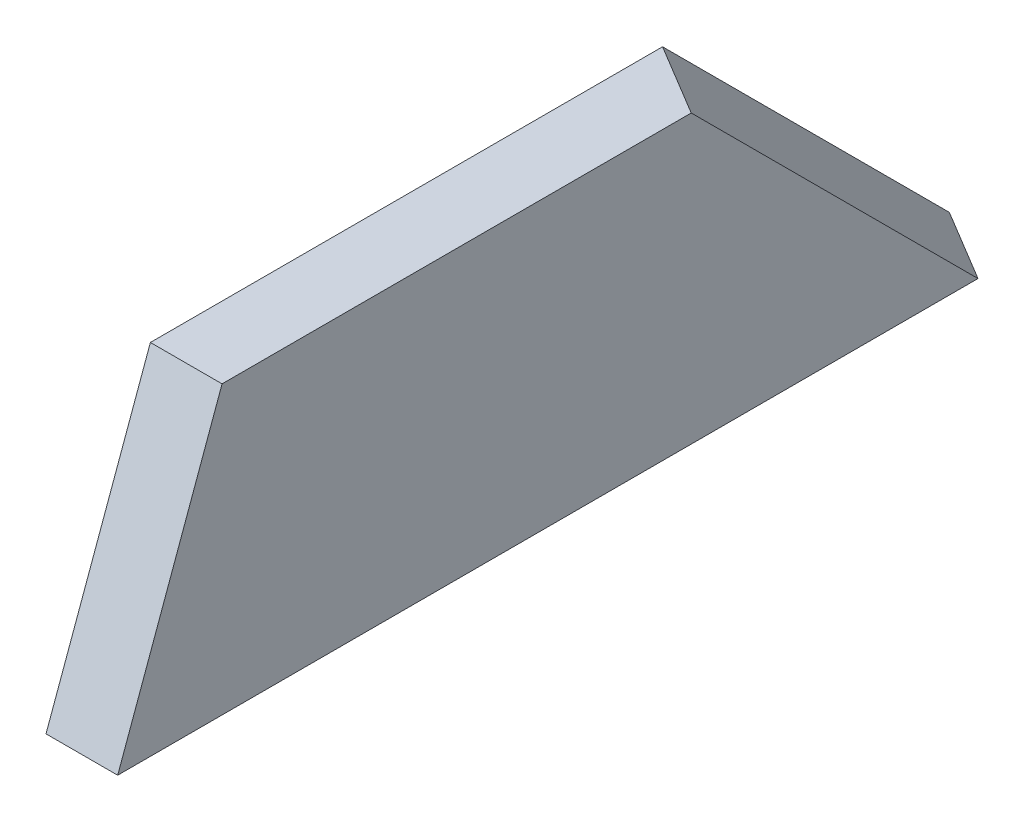
ISO-10303-21;
HEADER;
FILE_DESCRIPTION(('STEP AP214'),'2;1');
FILE_NAME('part.step','',(''),(''),'','','');
FILE_SCHEMA(('AUTOMOTIVE_DESIGN { 1 0 10303 214 1 1 1 1 }'));
ENDSEC;
DATA;
#1=APPLICATION_CONTEXT('core data for automotive mechanical design processes');
#2=APPLICATION_PROTOCOL_DEFINITION('international standard','automotive_design',2000,#1);
#3=PRODUCT_CONTEXT('',#1,'mechanical');
#4=PRODUCT('Part','Part','',(#3));
#5=PRODUCT_RELATED_PRODUCT_CATEGORY('part','',(#4));
#6=PRODUCT_DEFINITION_FORMATION('','',#4);
#7=PRODUCT_DEFINITION_CONTEXT('part definition',#1,'design');
#8=PRODUCT_DEFINITION('design','',#6,#7);
#9=PRODUCT_DEFINITION_SHAPE('','',#8);
#10=(LENGTH_UNIT() NAMED_UNIT(*) SI_UNIT(.MILLI.,.METRE.));
#11=(NAMED_UNIT(*) PLANE_ANGLE_UNIT() SI_UNIT($,.RADIAN.));
#12=(NAMED_UNIT(*) SI_UNIT($,.STERADIAN.) SOLID_ANGLE_UNIT());
#13=UNCERTAINTY_MEASURE_WITH_UNIT(LENGTH_MEASURE(1.E-05),#10,'distance_accuracy_value','');
#14=(GEOMETRIC_REPRESENTATION_CONTEXT(3) GLOBAL_UNCERTAINTY_ASSIGNED_CONTEXT((#13)) GLOBAL_UNIT_ASSIGNED_CONTEXT((#10,
#11,#12)) REPRESENTATION_CONTEXT('',''));
#15=CARTESIAN_POINT('',(0.,0.,0.));
#16=DIRECTION('',(0.,0.,1.));
#17=DIRECTION('',(1.,0.,0.));
#18=AXIS2_PLACEMENT_3D('',#15,#16,#17);
#19=CARTESIAN_POINT('',(12.7,50.8,-29.2099999999995));
#20=DIRECTION('',(0.,-1.,0.));
#21=DIRECTION('',(0.,0.,-1.));
#22=AXIS2_PLACEMENT_3D('',#19,#20,#21);
#23=PLANE('',#22);
#24=DIRECTION('',(0.,0.,1.));
#25=VECTOR('',#24,1.);
#26=CARTESIAN_POINT('',(12.7,50.8,-29.2099999999995));
#27=LINE('',#26,#25);
#28=CARTESIAN_POINT('',(12.7,50.8,-21.5899999999995));
#29=VERTEX_POINT('',#28);
#30=CARTESIAN_POINT('',(12.7,50.7999999999999,61.5203120992767));
#31=VERTEX_POINT('',#30);
#32=EDGE_CURVE('E85',#29,#31,#27,.T.);
#33=ORIENTED_EDGE('',*,*,#32,.F.);
#34=DIRECTION('',(0.857492925712545,0.,0.514495755427526));
#35=VECTOR('',#34,1.);
#36=CARTESIAN_POINT('',(18.2771998754359,50.8,-18.243680074738));
#37=LINE('',#36,#35);
#38=CARTESIAN_POINT('',(0.,50.8,-29.2099999999995));
#39=VERTEX_POINT('',#38);
#40=EDGE_CURVE('E90',#39,#29,#37,.T.);
#41=ORIENTED_EDGE('',*,*,#40,.F.);
#42=DIRECTION('',(0.,0.,1.));
#43=VECTOR('',#42,1.);
#44=CARTESIAN_POINT('',(0.,50.8,-29.2099999999995));
#45=LINE('',#44,#43);
#46=CARTESIAN_POINT('',(0.,50.7999999999999,61.5203120992767));
#47=VERTEX_POINT('',#46);
#48=EDGE_CURVE('E89',#39,#47,#45,.T.);
#49=ORIENTED_EDGE('',*,*,#48,.T.);
#50=DIRECTION('',(-1.,0.,0.));
#51=VECTOR('',#50,1.);
#52=CARTESIAN_POINT('',(12.7,50.7999999999999,61.5203120992767));
#53=LINE('',#52,#51);
#54=EDGE_CURVE('E11',#31,#47,#53,.T.);
#55=ORIENTED_EDGE('',*,*,#54,.F.);
#56=EDGE_LOOP('',(#33,#41,#49,#55));
#57=FACE_BOUND('',#56,.T.);
#58=ADVANCED_FACE('F32',(#57),#23,.F.);
#59=CARTESIAN_POINT('',(12.7,50.7999999999999,61.5203120992767));
#60=DIRECTION('',(0.,-0.342020143325672,-0.939692620785907));
#61=DIRECTION('',(0.,0.939692620785907,-0.342020143325672));
#62=AXIS2_PLACEMENT_3D('',#59,#60,#61);
#63=PLANE('',#62);
#64=DIRECTION('',(0.,-0.939692620785907,0.342020143325672));
#65=VECTOR('',#64,1.);
#66=CARTESIAN_POINT('',(0.,50.7999999999999,61.5203120992767));
#67=LINE('',#66,#65);
#68=CARTESIAN_POINT('',(0.,0.,80.01));
#69=VERTEX_POINT('',#68);
#70=EDGE_CURVE('E60',#47,#69,#67,.T.);
#71=ORIENTED_EDGE('',*,*,#70,.T.);
#72=DIRECTION('',(-1.,0.,0.));
#73=VECTOR('',#72,1.);
#74=CARTESIAN_POINT('',(12.7,0.,80.01));
#75=LINE('',#74,#73);
#76=CARTESIAN_POINT('',(12.7,0.,80.01));
#77=VERTEX_POINT('',#76);
#78=EDGE_CURVE('E40',#77,#69,#75,.T.);
#79=ORIENTED_EDGE('',*,*,#78,.F.);
#80=DIRECTION('',(0.,-0.939692620785907,0.342020143325672));
#81=VECTOR('',#80,1.);
#82=CARTESIAN_POINT('',(12.7,50.7999999999999,61.5203120992767));
#83=LINE('',#82,#81);
#84=EDGE_CURVE('E48',#31,#77,#83,.T.);
#85=ORIENTED_EDGE('',*,*,#84,.F.);
#86=ORIENTED_EDGE('',*,*,#54,.T.);
#87=EDGE_LOOP('',(#71,#79,#85,#86));
#88=FACE_BOUND('',#87,.T.);
#89=ADVANCED_FACE('F104',(#88),#63,.F.);
#90=CARTESIAN_POINT('',(12.7,0.,80.01));
#91=DIRECTION('',(0.,1.,0.));
#92=DIRECTION('',(0.,0.,1.));
#93=AXIS2_PLACEMENT_3D('',#90,#91,#92);
#94=PLANE('',#93);
#95=DIRECTION('',(0.,0.,-1.));
#96=VECTOR('',#95,1.);
#97=CARTESIAN_POINT('',(0.,0.,80.01));
#98=LINE('',#97,#96);
#99=CARTESIAN_POINT('',(0.,0.,-80.01));
#100=VERTEX_POINT('',#99);
#101=EDGE_CURVE('E82',#69,#100,#98,.T.);
#102=ORIENTED_EDGE('',*,*,#101,.T.);
#103=DIRECTION('',(-0.857492925712545,0.,-0.514495755427526));
#104=VECTOR('',#103,1.);
#105=CARTESIAN_POINT('',(12.7,0.,-72.39));
#106=LINE('',#105,#104);
#107=CARTESIAN_POINT('',(12.7,0.,-72.39));
#108=VERTEX_POINT('',#107);
#109=EDGE_CURVE('E67',#108,#100,#106,.T.);
#110=ORIENTED_EDGE('',*,*,#109,.F.);
#111=DIRECTION('',(0.,0.,-1.));
#112=VECTOR('',#111,1.);
#113=CARTESIAN_POINT('',(12.7,0.,80.01));
#114=LINE('',#113,#112);
#115=EDGE_CURVE('E95',#77,#108,#114,.T.);
#116=ORIENTED_EDGE('',*,*,#115,.F.);
#117=ORIENTED_EDGE('',*,*,#78,.T.);
#118=EDGE_LOOP('',(#102,#110,#116,#117));
#119=FACE_BOUND('',#118,.T.);
#120=ADVANCED_FACE('F83',(#119),#94,.F.);
#121=CARTESIAN_POINT('',(12.7,0.,0.));
#122=DIRECTION('',(1.,0.,0.));
#123=DIRECTION('',(0.,0.,-1.));
#124=AXIS2_PLACEMENT_3D('',#121,#122,#123);
#125=PLANE('',#124);
#126=DIRECTION('',(0.,-0.707106781186544,-0.707106781186551));
#127=VECTOR('',#126,1.);
#128=CARTESIAN_POINT('',(12.7,63.4416530509879,-8.94834694901145));
#129=LINE('',#128,#127);
#130=EDGE_CURVE('E77',#29,#108,#129,.T.);
#131=ORIENTED_EDGE('',*,*,#130,.F.);
#132=ORIENTED_EDGE('',*,*,#32,.T.);
#133=ORIENTED_EDGE('',*,*,#84,.T.);
#134=ORIENTED_EDGE('',*,*,#115,.T.);
#135=EDGE_LOOP('',(#131,#132,#133,#134));
#136=FACE_BOUND('',#135,.T.);
#137=ADVANCED_FACE('F102',(#136),#125,.T.);
#138=CARTESIAN_POINT('',(0.,0.,0.));
#139=DIRECTION('',(1.,0.,0.));
#140=DIRECTION('',(0.,0.,-1.));
#141=AXIS2_PLACEMENT_3D('',#138,#139,#140);
#142=PLANE('',#141);
#143=DIRECTION('',(0.,0.707106781186544,0.707106781186551));
#144=VECTOR('',#143,1.);
#145=CARTESIAN_POINT('',(0.,0.,-80.01));
#146=LINE('',#145,#144);
#147=EDGE_CURVE('E73',#100,#39,#146,.T.);
#148=ORIENTED_EDGE('',*,*,#147,.F.);
#149=ORIENTED_EDGE('',*,*,#101,.F.);
#150=ORIENTED_EDGE('',*,*,#70,.F.);
#151=ORIENTED_EDGE('',*,*,#48,.F.);
#152=EDGE_LOOP('',(#148,#149,#150,#151));
#153=FACE_BOUND('',#152,.T.);
#154=ADVANCED_FACE('F88',(#153),#142,.F.);
#155=CARTESIAN_POINT('',(12.7,63.4416530509879,-8.94834694901145));
#156=DIRECTION('',(-0.390566732942469,-0.650944554904124,0.650944554904117));
#157=DIRECTION('',(0.,-0.707106781186544,-0.707106781186551));
#158=AXIS2_PLACEMENT_3D('',#155,#156,#157);
#159=PLANE('',#158);
#160=ORIENTED_EDGE('',*,*,#40,.T.);
#161=ORIENTED_EDGE('',*,*,#130,.T.);
#162=ORIENTED_EDGE('',*,*,#109,.T.);
#163=ORIENTED_EDGE('',*,*,#147,.T.);
#164=EDGE_LOOP('',(#160,#161,#162,#163));
#165=FACE_BOUND('',#164,.T.);
#166=ADVANCED_FACE('F70',(#165),#159,.F.);
#167=CLOSED_SHELL('',(#58,#89,#120,#137,#154,#166));
#168=MANIFOLD_SOLID_BREP('B2',#167);
#169=ADVANCED_BREP_SHAPE_REPRESENTATION('',(#18,#168),#14);
#170=SHAPE_DEFINITION_REPRESENTATION(#9,#169);
ENDSEC;
END-ISO-10303-21;
